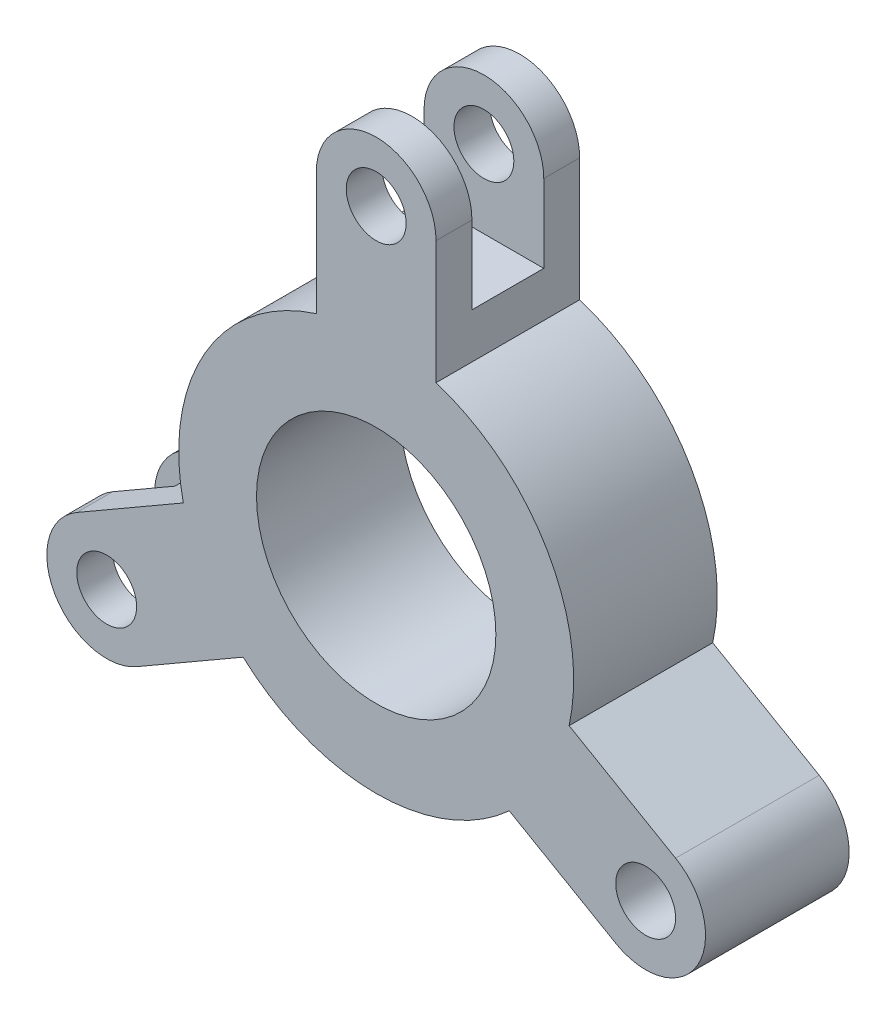
ISO-10303-21;
HEADER;
FILE_DESCRIPTION(('STEP AP214'),'2;1');
FILE_NAME('part.step','',(''),(''),'','','');
FILE_SCHEMA(('AUTOMOTIVE_DESIGN { 1 0 10303 214 1 1 1 1 }'));
ENDSEC;
DATA;
#1=APPLICATION_CONTEXT('core data for automotive mechanical design processes');
#2=APPLICATION_PROTOCOL_DEFINITION('international standard','automotive_design',2000,#1);
#3=PRODUCT_CONTEXT('',#1,'mechanical');
#4=PRODUCT('Part','Part','',(#3));
#5=PRODUCT_RELATED_PRODUCT_CATEGORY('part','',(#4));
#6=PRODUCT_DEFINITION_FORMATION('','',#4);
#7=PRODUCT_DEFINITION_CONTEXT('part definition',#1,'design');
#8=PRODUCT_DEFINITION('design','',#6,#7);
#9=PRODUCT_DEFINITION_SHAPE('','',#8);
#10=(LENGTH_UNIT() NAMED_UNIT(*) SI_UNIT(.MILLI.,.METRE.));
#11=(NAMED_UNIT(*) PLANE_ANGLE_UNIT() SI_UNIT($,.RADIAN.));
#12=(NAMED_UNIT(*) SI_UNIT($,.STERADIAN.) SOLID_ANGLE_UNIT());
#13=UNCERTAINTY_MEASURE_WITH_UNIT(LENGTH_MEASURE(1.E-05),#10,'distance_accuracy_value','');
#14=(GEOMETRIC_REPRESENTATION_CONTEXT(3) GLOBAL_UNCERTAINTY_ASSIGNED_CONTEXT((#13)) GLOBAL_UNIT_ASSIGNED_CONTEXT((#10,
#11,#12)) REPRESENTATION_CONTEXT('',''));
#15=CARTESIAN_POINT('',(0.,0.,0.));
#16=DIRECTION('',(0.,0.,1.));
#17=DIRECTION('',(1.,0.,0.));
#18=AXIS2_PLACEMENT_3D('',#15,#16,#17);
#19=CARTESIAN_POINT('',(-22.5166604983954,-13.,-6.));
#20=DIRECTION('',(0.,0.,1.));
#21=DIRECTION('',(1.,0.,0.));
#22=AXIS2_PLACEMENT_3D('',#19,#20,#21);
#23=CYLINDRICAL_SURFACE('',#22,5.);
#24=DIRECTION('',(0.,0.,1.));
#25=VECTOR('',#24,1.);
#26=CARTESIAN_POINT('',(-25.0166604983954,-8.6698729810778,-6.));
#27=LINE('',#26,#25);
#28=CARTESIAN_POINT('',(-25.0166604983954,-8.6698729810778,3.));
#29=VERTEX_POINT('',#28);
#30=CARTESIAN_POINT('',(-25.0166604983954,-8.6698729810778,6.));
#31=VERTEX_POINT('',#30);
#32=EDGE_CURVE('E365',#29,#31,#27,.T.);
#33=ORIENTED_EDGE('',*,*,#32,.F.);
#34=CARTESIAN_POINT('',(-22.5166604983954,-13.,3.));
#35=DIRECTION('',(0.,0.,-1.));
#36=DIRECTION('',(-1.,0.,0.));
#37=AXIS2_PLACEMENT_3D('',#34,#35,#36);
#38=CIRCLE('',#37,5.);
#39=CARTESIAN_POINT('',(-20.0166604983954,-17.3301270189222,3.));
#40=VERTEX_POINT('',#39);
#41=EDGE_CURVE('E64',#29,#40,#38,.F.);
#42=ORIENTED_EDGE('',*,*,#41,.T.);
#43=DIRECTION('',(0.,0.,1.));
#44=VECTOR('',#43,1.);
#45=CARTESIAN_POINT('',(-20.0166604983954,-17.3301270189222,-6.));
#46=LINE('',#45,#44);
#47=CARTESIAN_POINT('',(-20.0166604983954,-17.3301270189222,6.));
#48=VERTEX_POINT('',#47);
#49=EDGE_CURVE('E363',#40,#48,#46,.T.);
#50=ORIENTED_EDGE('',*,*,#49,.T.);
#51=CARTESIAN_POINT('',(-22.5166604983954,-13.,6.));
#52=DIRECTION('',(0.,0.,1.));
#53=DIRECTION('',(1.,0.,0.));
#54=AXIS2_PLACEMENT_3D('',#51,#52,#53);
#55=CIRCLE('',#54,5.);
#56=EDGE_CURVE('E251',#31,#48,#55,.T.);
#57=ORIENTED_EDGE('',*,*,#56,.F.);
#58=EDGE_LOOP('',(#33,#42,#50,#57));
#59=FACE_BOUND('',#58,.T.);
#60=ADVANCED_FACE('F49',(#59),#23,.T.);
#61=CARTESIAN_POINT('',(-22.5166604983954,-13.,-6.));
#62=DIRECTION('',(0.,0.,1.));
#63=DIRECTION('',(1.,0.,0.));
#64=AXIS2_PLACEMENT_3D('',#61,#62,#63);
#65=CYLINDRICAL_SURFACE('',#64,2.5);
#66=CARTESIAN_POINT('',(-22.5166604983954,-13.,6.));
#67=DIRECTION('',(0.,0.,1.));
#68=DIRECTION('',(1.,0.,0.));
#69=AXIS2_PLACEMENT_3D('',#66,#67,#68);
#70=CIRCLE('',#69,2.5);
#71=CARTESIAN_POINT('',(-20.0166604983954,-13.,6.));
#72=VERTEX_POINT('',#71);
#73=EDGE_CURVE('E290',#72,#72,#70,.T.);
#74=ORIENTED_EDGE('',*,*,#73,.T.);
#75=EDGE_LOOP('',(#74));
#76=FACE_BOUND('',#75,.T.);
#77=CARTESIAN_POINT('',(-22.5166604983954,-13.,3.));
#78=DIRECTION('',(0.,0.,-1.));
#79=DIRECTION('',(-1.,0.,0.));
#80=AXIS2_PLACEMENT_3D('',#77,#78,#79);
#81=CIRCLE('',#80,2.5);
#82=CARTESIAN_POINT('',(-25.0166604983954,-13.,3.));
#83=VERTEX_POINT('',#82);
#84=EDGE_CURVE('E191',#83,#83,#81,.F.);
#85=ORIENTED_EDGE('',*,*,#84,.F.);
#86=EDGE_LOOP('',(#85));
#87=FACE_BOUND('',#86,.T.);
#88=ADVANCED_FACE('F377',(#76,#87),#65,.F.);
#89=CARTESIAN_POINT('',(-5.,0.,-6.));
#90=DIRECTION('',(1.,0.,0.));
#91=DIRECTION('',(0.,0.,-1.));
#92=AXIS2_PLACEMENT_3D('',#89,#90,#91);
#93=PLANE('',#92);
#94=DIRECTION('',(0.,1.,0.));
#95=VECTOR('',#94,1.);
#96=CARTESIAN_POINT('',(-5.,0.,3.));
#97=LINE('',#96,#95);
#98=CARTESIAN_POINT('',(-5.,19.5,3.));
#99=VERTEX_POINT('',#98);
#100=CARTESIAN_POINT('',(-5.,26.,3.));
#101=VERTEX_POINT('',#100);
#102=EDGE_CURVE('E241',#99,#101,#97,.T.);
#103=ORIENTED_EDGE('',*,*,#102,.F.);
#104=DIRECTION('',(0.,0.,1.));
#105=VECTOR('',#104,1.);
#106=CARTESIAN_POINT('',(-5.,19.5,-6.));
#107=LINE('',#106,#105);
#108=CARTESIAN_POINT('',(-5.,19.5,-3.));
#109=VERTEX_POINT('',#108);
#110=EDGE_CURVE('E243',#109,#99,#107,.T.);
#111=ORIENTED_EDGE('',*,*,#110,.F.);
#112=DIRECTION('',(0.,1.,0.));
#113=VECTOR('',#112,1.);
#114=CARTESIAN_POINT('',(-5.,0.,-3.));
#115=LINE('',#114,#113);
#116=CARTESIAN_POINT('',(-5.,26.,-3.));
#117=VERTEX_POINT('',#116);
#118=EDGE_CURVE('E231',#109,#117,#115,.T.);
#119=ORIENTED_EDGE('',*,*,#118,.T.);
#120=DIRECTION('',(0.,0.,1.));
#121=VECTOR('',#120,1.);
#122=CARTESIAN_POINT('',(-5.,26.,-6.));
#123=LINE('',#122,#121);
#124=CARTESIAN_POINT('',(-5.,26.,-6.));
#125=VERTEX_POINT('',#124);
#126=EDGE_CURVE('E340',#125,#117,#123,.T.);
#127=ORIENTED_EDGE('',*,*,#126,.F.);
#128=DIRECTION('',(0.,1.,0.));
#129=VECTOR('',#128,1.);
#130=CARTESIAN_POINT('',(-5.,0.,-6.));
#131=LINE('',#130,#129);
#132=CARTESIAN_POINT('',(-5.,15.7241851935164,-6.));
#133=VERTEX_POINT('',#132);
#134=EDGE_CURVE('E323',#133,#125,#131,.T.);
#135=ORIENTED_EDGE('',*,*,#134,.F.);
#136=DIRECTION('',(0.,0.,1.));
#137=VECTOR('',#136,1.);
#138=CARTESIAN_POINT('',(-5.,15.7241851935164,-6.));
#139=LINE('',#138,#137);
#140=CARTESIAN_POINT('',(-5.,15.7241851935164,6.));
#141=VERTEX_POINT('',#140);
#142=EDGE_CURVE('E338',#133,#141,#139,.T.);
#143=ORIENTED_EDGE('',*,*,#142,.T.);
#144=DIRECTION('',(0.,1.,0.));
#145=VECTOR('',#144,1.);
#146=CARTESIAN_POINT('',(-5.,0.,6.));
#147=LINE('',#146,#145);
#148=CARTESIAN_POINT('',(-5.,26.,6.));
#149=VERTEX_POINT('',#148);
#150=EDGE_CURVE('E278',#141,#149,#147,.T.);
#151=ORIENTED_EDGE('',*,*,#150,.T.);
#152=EDGE_CURVE('E343',#101,#149,#123,.T.);
#153=ORIENTED_EDGE('',*,*,#152,.F.);
#154=EDGE_LOOP('',(#103,#111,#119,#127,#135,#143,#151,#153));
#155=FACE_BOUND('',#154,.T.);
#156=ADVANCED_FACE('F379',(#155),#93,.F.);
#157=CARTESIAN_POINT('',(0.,26.,-6.));
#158=DIRECTION('',(0.,0.,1.));
#159=DIRECTION('',(1.,0.,0.));
#160=AXIS2_PLACEMENT_3D('',#157,#158,#159);
#161=CYLINDRICAL_SURFACE('',#160,5.);
#162=DIRECTION('',(0.,0.,1.));
#163=VECTOR('',#162,1.);
#164=CARTESIAN_POINT('',(5.,26.,-6.));
#165=LINE('',#164,#163);
#166=CARTESIAN_POINT('',(5.,26.,3.));
#167=VERTEX_POINT('',#166);
#168=CARTESIAN_POINT('',(5.,26.,6.));
#169=VERTEX_POINT('',#168);
#170=EDGE_CURVE('E347',#167,#169,#165,.T.);
#171=ORIENTED_EDGE('',*,*,#170,.F.);
#172=CARTESIAN_POINT('',(0.,26.,3.));
#173=DIRECTION('',(0.,0.,-1.));
#174=DIRECTION('',(-1.,0.,0.));
#175=AXIS2_PLACEMENT_3D('',#172,#173,#174);
#176=CIRCLE('',#175,5.);
#177=EDGE_CURVE('E238',#167,#101,#176,.F.);
#178=ORIENTED_EDGE('',*,*,#177,.T.);
#179=ORIENTED_EDGE('',*,*,#152,.T.);
#180=CARTESIAN_POINT('',(0.,26.,6.));
#181=DIRECTION('',(0.,0.,1.));
#182=DIRECTION('',(1.,0.,0.));
#183=AXIS2_PLACEMENT_3D('',#180,#181,#182);
#184=CIRCLE('',#183,5.);
#185=EDGE_CURVE('E275',#169,#149,#184,.T.);
#186=ORIENTED_EDGE('',*,*,#185,.F.);
#187=EDGE_LOOP('',(#171,#178,#179,#186));
#188=FACE_BOUND('',#187,.T.);
#189=ADVANCED_FACE('F388',(#188),#161,.T.);
#190=CARTESIAN_POINT('',(5.,0.,-6.));
#191=DIRECTION('',(1.,0.,0.));
#192=DIRECTION('',(0.,0.,-1.));
#193=AXIS2_PLACEMENT_3D('',#190,#191,#192);
#194=PLANE('',#193);
#195=DIRECTION('',(0.,0.,1.));
#196=VECTOR('',#195,1.);
#197=CARTESIAN_POINT('',(5.,19.5,-6.));
#198=LINE('',#197,#196);
#199=CARTESIAN_POINT('',(5.,19.5,-3.));
#200=VERTEX_POINT('',#199);
#201=CARTESIAN_POINT('',(5.,19.5,3.));
#202=VERTEX_POINT('',#201);
#203=EDGE_CURVE('E57',#200,#202,#198,.T.);
#204=ORIENTED_EDGE('',*,*,#203,.T.);
#205=DIRECTION('',(0.,1.,0.));
#206=VECTOR('',#205,1.);
#207=CARTESIAN_POINT('',(5.,0.,3.));
#208=LINE('',#207,#206);
#209=EDGE_CURVE('E235',#202,#167,#208,.T.);
#210=ORIENTED_EDGE('',*,*,#209,.T.);
#211=ORIENTED_EDGE('',*,*,#170,.T.);
#212=DIRECTION('',(0.,1.,0.));
#213=VECTOR('',#212,1.);
#214=CARTESIAN_POINT('',(5.,0.,6.));
#215=LINE('',#214,#213);
#216=CARTESIAN_POINT('',(5.,15.7241851935164,6.));
#217=VERTEX_POINT('',#216);
#218=EDGE_CURVE('E272',#217,#169,#215,.T.);
#219=ORIENTED_EDGE('',*,*,#218,.F.);
#220=DIRECTION('',(0.,0.,1.));
#221=VECTOR('',#220,1.);
#222=CARTESIAN_POINT('',(5.,15.7241851935164,-6.));
#223=LINE('',#222,#221);
#224=CARTESIAN_POINT('',(5.,15.7241851935164,-6.));
#225=VERTEX_POINT('',#224);
#226=EDGE_CURVE('E348',#225,#217,#223,.T.);
#227=ORIENTED_EDGE('',*,*,#226,.F.);
#228=DIRECTION('',(0.,1.,0.));
#229=VECTOR('',#228,1.);
#230=CARTESIAN_POINT('',(5.,0.,-6.));
#231=LINE('',#230,#229);
#232=CARTESIAN_POINT('',(5.,26.,-6.));
#233=VERTEX_POINT('',#232);
#234=EDGE_CURVE('E317',#225,#233,#231,.T.);
#235=ORIENTED_EDGE('',*,*,#234,.T.);
#236=CARTESIAN_POINT('',(5.,26.,-3.));
#237=VERTEX_POINT('',#236);
#238=EDGE_CURVE('E344',#233,#237,#165,.T.);
#239=ORIENTED_EDGE('',*,*,#238,.T.);
#240=DIRECTION('',(0.,1.,0.));
#241=VECTOR('',#240,1.);
#242=CARTESIAN_POINT('',(5.,0.,-3.));
#243=LINE('',#242,#241);
#244=EDGE_CURVE('E227',#200,#237,#243,.T.);
#245=ORIENTED_EDGE('',*,*,#244,.F.);
#246=EDGE_LOOP('',(#204,#210,#211,#219,#227,#235,#239,#245));
#247=FACE_BOUND('',#246,.T.);
#248=ADVANCED_FACE('F439',(#247),#194,.T.);
#249=CARTESIAN_POINT('',(0.,26.,-6.));
#250=DIRECTION('',(0.,0.,1.));
#251=DIRECTION('',(1.,0.,0.));
#252=AXIS2_PLACEMENT_3D('',#249,#250,#251);
#253=CYLINDRICAL_SURFACE('',#252,2.5);
#254=CARTESIAN_POINT('',(0.,26.,6.));
#255=DIRECTION('',(0.,0.,1.));
#256=DIRECTION('',(1.,0.,0.));
#257=AXIS2_PLACEMENT_3D('',#254,#255,#256);
#258=CIRCLE('',#257,2.5);
#259=CARTESIAN_POINT('',(2.5,26.,6.));
#260=VERTEX_POINT('',#259);
#261=EDGE_CURVE('E284',#260,#260,#258,.T.);
#262=ORIENTED_EDGE('',*,*,#261,.T.);
#263=EDGE_LOOP('',(#262));
#264=FACE_BOUND('',#263,.T.);
#265=CARTESIAN_POINT('',(0.,26.,3.));
#266=DIRECTION('',(0.,0.,-1.));
#267=DIRECTION('',(-1.,0.,0.));
#268=AXIS2_PLACEMENT_3D('',#265,#266,#267);
#269=CIRCLE('',#268,2.5);
#270=CARTESIAN_POINT('',(-2.5,26.,3.));
#271=VERTEX_POINT('',#270);
#272=EDGE_CURVE('E234',#271,#271,#269,.F.);
#273=ORIENTED_EDGE('',*,*,#272,.F.);
#274=EDGE_LOOP('',(#273));
#275=FACE_BOUND('',#274,.T.);
#276=ADVANCED_FACE('F490',(#264,#275),#253,.F.);
#277=CARTESIAN_POINT('',(0.,0.,-6.));
#278=DIRECTION('',(0.,0.,1.));
#279=DIRECTION('',(1.,0.,0.));
#280=AXIS2_PLACEMENT_3D('',#277,#278,#279);
#281=CYLINDRICAL_SURFACE('',#280,16.5);
#282=DIRECTION('',(0.,0.,1.));
#283=VECTOR('',#282,1.);
#284=CARTESIAN_POINT('',(-16.1175438313963,-3.531965577836,-6.));
#285=LINE('',#284,#283);
#286=CARTESIAN_POINT('',(-16.1175438313963,-3.531965577836,-6.));
#287=VERTEX_POINT('',#286);
#288=CARTESIAN_POINT('',(-16.1175438313963,-3.531965577836,6.));
#289=VERTEX_POINT('',#288);
#290=EDGE_CURVE('E337',#287,#289,#285,.T.);
#291=ORIENTED_EDGE('',*,*,#290,.T.);
#292=CARTESIAN_POINT('',(0.,0.,6.));
#293=DIRECTION('',(0.,0.,1.));
#294=DIRECTION('',(1.,0.,0.));
#295=AXIS2_PLACEMENT_3D('',#292,#293,#294);
#296=CIRCLE('',#295,16.5);
#297=EDGE_CURVE('E245',#141,#289,#296,.T.);
#298=ORIENTED_EDGE('',*,*,#297,.F.);
#299=ORIENTED_EDGE('',*,*,#142,.F.);
#300=CARTESIAN_POINT('',(0.,0.,-6.));
#301=DIRECTION('',(0.,0.,1.));
#302=DIRECTION('',(1.,0.,0.));
#303=AXIS2_PLACEMENT_3D('',#300,#301,#302);
#304=CIRCLE('',#303,16.5);
#305=EDGE_CURVE('E293',#133,#287,#304,.T.);
#306=ORIENTED_EDGE('',*,*,#305,.T.);
#307=EDGE_LOOP('',(#291,#298,#299,#306));
#308=FACE_BOUND('',#307,.T.);
#309=ADVANCED_FACE('F51',(#308),#281,.T.);
#310=CARTESIAN_POINT('',(0.,26.,-3.));
#311=DIRECTION('',(0.,0.,-1.));
#312=DIRECTION('',(-1.,0.,0.));
#313=AXIS2_PLACEMENT_3D('',#310,#311,#312);
#314=CIRCLE('',#313,5.);
#315=EDGE_CURVE('E229',#237,#117,#314,.F.);
#316=ORIENTED_EDGE('',*,*,#315,.F.);
#317=ORIENTED_EDGE('',*,*,#238,.F.);
#318=CARTESIAN_POINT('',(0.,26.,-6.));
#319=DIRECTION('',(0.,0.,1.));
#320=DIRECTION('',(1.,0.,0.));
#321=AXIS2_PLACEMENT_3D('',#318,#319,#320);
#322=CIRCLE('',#321,5.);
#323=EDGE_CURVE('E320',#233,#125,#322,.T.);
#324=ORIENTED_EDGE('',*,*,#323,.T.);
#325=ORIENTED_EDGE('',*,*,#126,.T.);
#326=EDGE_LOOP('',(#316,#317,#324,#325));
#327=FACE_BOUND('',#326,.T.);
#328=ADVANCED_FACE('F497',(#327),#161,.T.);
#329=CARTESIAN_POINT('',(0.,0.,-6.));
#330=DIRECTION('',(0.,0.,1.));
#331=DIRECTION('',(1.,0.,0.));
#332=AXIS2_PLACEMENT_3D('',#329,#330,#331);
#333=CYLINDRICAL_SURFACE('',#332,16.5);
#334=ORIENTED_EDGE('',*,*,#226,.T.);
#335=CARTESIAN_POINT('',(0.,0.,6.));
#336=DIRECTION('',(0.,0.,1.));
#337=DIRECTION('',(1.,0.,0.));
#338=AXIS2_PLACEMENT_3D('',#335,#336,#337);
#339=CIRCLE('',#338,16.5);
#340=CARTESIAN_POINT('',(16.1175438313963,-3.53196557783599,6.));
#341=VERTEX_POINT('',#340);
#342=EDGE_CURVE('E269',#341,#217,#339,.T.);
#343=ORIENTED_EDGE('',*,*,#342,.F.);
#344=DIRECTION('',(0.,0.,1.));
#345=VECTOR('',#344,1.);
#346=CARTESIAN_POINT('',(16.1175438313963,-3.53196557783599,-6.));
#347=LINE('',#346,#345);
#348=CARTESIAN_POINT('',(16.1175438313963,-3.53196557783599,-6.));
#349=VERTEX_POINT('',#348);
#350=EDGE_CURVE('E350',#349,#341,#347,.T.);
#351=ORIENTED_EDGE('',*,*,#350,.F.);
#352=CARTESIAN_POINT('',(0.,0.,-6.));
#353=DIRECTION('',(0.,0.,1.));
#354=DIRECTION('',(1.,0.,0.));
#355=AXIS2_PLACEMENT_3D('',#352,#353,#354);
#356=CIRCLE('',#355,16.5);
#357=EDGE_CURVE('E314',#349,#225,#356,.T.);
#358=ORIENTED_EDGE('',*,*,#357,.T.);
#359=EDGE_LOOP('',(#334,#343,#351,#358));
#360=FACE_BOUND('',#359,.T.);
#361=ADVANCED_FACE('F444',(#360),#333,.T.);
#362=CARTESIAN_POINT('',(2.5,4.3301270189222,-6.));
#363=DIRECTION('',(-0.5,-0.866025403784439,0.));
#364=DIRECTION('',(0.866025403784439,-0.5,0.));
#365=AXIS2_PLACEMENT_3D('',#362,#363,#364);
#366=PLANE('',#365);
#367=ORIENTED_EDGE('',*,*,#350,.T.);
#368=DIRECTION('',(0.866025403784439,-0.5,0.));
#369=VECTOR('',#368,1.);
#370=CARTESIAN_POINT('',(2.5,4.3301270189222,6.));
#371=LINE('',#370,#369);
#372=CARTESIAN_POINT('',(25.0166604983954,-8.6698729810778,6.));
#373=VERTEX_POINT('',#372);
#374=EDGE_CURVE('E266',#341,#373,#371,.T.);
#375=ORIENTED_EDGE('',*,*,#374,.T.);
#376=DIRECTION('',(0.,0.,1.));
#377=VECTOR('',#376,1.);
#378=CARTESIAN_POINT('',(25.0166604983954,-8.6698729810778,-6.));
#379=LINE('',#378,#377);
#380=CARTESIAN_POINT('',(25.0166604983954,-8.6698729810778,-6.));
#381=VERTEX_POINT('',#380);
#382=EDGE_CURVE('E352',#381,#373,#379,.T.);
#383=ORIENTED_EDGE('',*,*,#382,.F.);
#384=DIRECTION('',(0.866025403784439,-0.5,0.));
#385=VECTOR('',#384,1.);
#386=CARTESIAN_POINT('',(2.5,4.3301270189222,-6.));
#387=LINE('',#386,#385);
#388=EDGE_CURVE('E312',#349,#381,#387,.T.);
#389=ORIENTED_EDGE('',*,*,#388,.F.);
#390=EDGE_LOOP('',(#367,#375,#383,#389));
#391=FACE_BOUND('',#390,.T.);
#392=ADVANCED_FACE('F450',(#391),#366,.F.);
#393=CARTESIAN_POINT('',(22.5166604983954,-13.,-6.));
#394=DIRECTION('',(0.,0.,1.));
#395=DIRECTION('',(1.,0.,0.));
#396=AXIS2_PLACEMENT_3D('',#393,#394,#395);
#397=CYLINDRICAL_SURFACE('',#396,5.);
#398=ORIENTED_EDGE('',*,*,#382,.T.);
#399=CARTESIAN_POINT('',(22.5166604983954,-13.,6.));
#400=DIRECTION('',(0.,0.,1.));
#401=DIRECTION('',(1.,0.,0.));
#402=AXIS2_PLACEMENT_3D('',#399,#400,#401);
#403=CIRCLE('',#402,5.);
#404=CARTESIAN_POINT('',(20.0166604983954,-17.3301270189222,6.));
#405=VERTEX_POINT('',#404);
#406=EDGE_CURVE('E263',#405,#373,#403,.T.);
#407=ORIENTED_EDGE('',*,*,#406,.F.);
#408=DIRECTION('',(0.,0.,1.));
#409=VECTOR('',#408,1.);
#410=CARTESIAN_POINT('',(20.0166604983954,-17.3301270189222,-6.));
#411=LINE('',#410,#409);
#412=CARTESIAN_POINT('',(20.0166604983954,-17.3301270189222,-6.));
#413=VERTEX_POINT('',#412);
#414=EDGE_CURVE('E354',#413,#405,#411,.T.);
#415=ORIENTED_EDGE('',*,*,#414,.F.);
#416=CARTESIAN_POINT('',(22.5166604983954,-13.,-6.));
#417=DIRECTION('',(0.,0.,1.));
#418=DIRECTION('',(1.,0.,0.));
#419=AXIS2_PLACEMENT_3D('',#416,#417,#418);
#420=CIRCLE('',#419,5.);
#421=EDGE_CURVE('E309',#413,#381,#420,.T.);
#422=ORIENTED_EDGE('',*,*,#421,.T.);
#423=EDGE_LOOP('',(#398,#407,#415,#422));
#424=FACE_BOUND('',#423,.T.);
#425=ADVANCED_FACE('F462',(#424),#397,.T.);
#426=CARTESIAN_POINT('',(-2.5,-4.33012701892219,-6.));
#427=DIRECTION('',(-0.5,-0.866025403784439,0.));
#428=DIRECTION('',(0.866025403784439,-0.5,0.));
#429=AXIS2_PLACEMENT_3D('',#426,#427,#428);
#430=PLANE('',#429);
#431=ORIENTED_EDGE('',*,*,#414,.T.);
#432=DIRECTION('',(0.866025403784439,-0.5,0.));
#433=VECTOR('',#432,1.);
#434=CARTESIAN_POINT('',(-2.5,-4.33012701892219,6.));
#435=LINE('',#434,#433);
#436=CARTESIAN_POINT('',(11.1175438313963,-12.1922196156804,6.));
#437=VERTEX_POINT('',#436);
#438=EDGE_CURVE('E260',#437,#405,#435,.T.);
#439=ORIENTED_EDGE('',*,*,#438,.F.);
#440=DIRECTION('',(0.,0.,1.));
#441=VECTOR('',#440,1.);
#442=CARTESIAN_POINT('',(11.1175438313963,-12.1922196156804,-6.));
#443=LINE('',#442,#441);
#444=CARTESIAN_POINT('',(11.1175438313963,-12.1922196156804,-6.));
#445=VERTEX_POINT('',#444);
#446=EDGE_CURVE('E356',#445,#437,#443,.T.);
#447=ORIENTED_EDGE('',*,*,#446,.F.);
#448=DIRECTION('',(0.866025403784439,-0.5,0.));
#449=VECTOR('',#448,1.);
#450=CARTESIAN_POINT('',(-2.5,-4.33012701892219,-6.));
#451=LINE('',#450,#449);
#452=EDGE_CURVE('E306',#445,#413,#451,.T.);
#453=ORIENTED_EDGE('',*,*,#452,.T.);
#454=EDGE_LOOP('',(#431,#439,#447,#453));
#455=FACE_BOUND('',#454,.T.);
#456=ADVANCED_FACE('F457',(#455),#430,.T.);
#457=CARTESIAN_POINT('',(0.,0.,-6.));
#458=DIRECTION('',(0.,0.,1.));
#459=DIRECTION('',(1.,0.,0.));
#460=AXIS2_PLACEMENT_3D('',#457,#458,#459);
#461=CYLINDRICAL_SURFACE('',#460,16.5);
#462=ORIENTED_EDGE('',*,*,#446,.T.);
#463=CARTESIAN_POINT('',(0.,0.,6.));
#464=DIRECTION('',(0.,0.,1.));
#465=DIRECTION('',(1.,0.,0.));
#466=AXIS2_PLACEMENT_3D('',#463,#464,#465);
#467=CIRCLE('',#466,16.5);
#468=CARTESIAN_POINT('',(-11.1175438313963,-12.1922196156804,6.));
#469=VERTEX_POINT('',#468);
#470=EDGE_CURVE('E257',#469,#437,#467,.T.);
#471=ORIENTED_EDGE('',*,*,#470,.F.);
#472=DIRECTION('',(0.,0.,1.));
#473=VECTOR('',#472,1.);
#474=CARTESIAN_POINT('',(-11.1175438313963,-12.1922196156804,-6.));
#475=LINE('',#474,#473);
#476=CARTESIAN_POINT('',(-11.1175438313963,-12.1922196156804,-6.));
#477=VERTEX_POINT('',#476);
#478=EDGE_CURVE('E358',#477,#469,#475,.T.);
#479=ORIENTED_EDGE('',*,*,#478,.F.);
#480=CARTESIAN_POINT('',(0.,0.,-6.));
#481=DIRECTION('',(0.,0.,1.));
#482=DIRECTION('',(1.,0.,0.));
#483=AXIS2_PLACEMENT_3D('',#480,#481,#482);
#484=CIRCLE('',#483,16.5);
#485=EDGE_CURVE('E303',#477,#445,#484,.T.);
#486=ORIENTED_EDGE('',*,*,#485,.T.);
#487=EDGE_LOOP('',(#462,#471,#479,#486));
#488=FACE_BOUND('',#487,.T.);
#489=ADVANCED_FACE('F461',(#488),#461,.T.);
#490=CARTESIAN_POINT('',(2.5,-4.3301270189222,-6.));
#491=DIRECTION('',(-0.5,0.866025403784439,0.));
#492=DIRECTION('',(-0.866025403784439,-0.5,0.));
#493=AXIS2_PLACEMENT_3D('',#490,#491,#492);
#494=PLANE('',#493);
#495=DIRECTION('',(0.,0.,1.));
#496=VECTOR('',#495,1.);
#497=CARTESIAN_POINT('',(-14.8205080756888,-14.3301270189222,-6.));
#498=LINE('',#497,#496);
#499=CARTESIAN_POINT('',(-14.8205080756888,-14.3301270189222,-3.));
#500=VERTEX_POINT('',#499);
#501=CARTESIAN_POINT('',(-14.8205080756888,-14.3301270189222,3.));
#502=VERTEX_POINT('',#501);
#503=EDGE_CURVE('E198',#500,#502,#498,.T.);
#504=ORIENTED_EDGE('',*,*,#503,.F.);
#505=DIRECTION('',(-0.866025403784439,-0.5,0.));
#506=VECTOR('',#505,1.);
#507=CARTESIAN_POINT('',(2.5,-4.3301270189222,-3.));
#508=LINE('',#507,#506);
#509=CARTESIAN_POINT('',(-20.0166604983954,-17.3301270189222,-3.));
#510=VERTEX_POINT('',#509);
#511=EDGE_CURVE('E212',#500,#510,#508,.T.);
#512=ORIENTED_EDGE('',*,*,#511,.T.);
#513=CARTESIAN_POINT('',(-20.0166604983954,-17.3301270189222,-6.));
#514=VERTEX_POINT('',#513);
#515=EDGE_CURVE('E360',#514,#510,#46,.T.);
#516=ORIENTED_EDGE('',*,*,#515,.F.);
#517=DIRECTION('',(-0.866025403784439,-0.5,0.));
#518=VECTOR('',#517,1.);
#519=CARTESIAN_POINT('',(2.5,-4.3301270189222,-6.));
#520=LINE('',#519,#518);
#521=EDGE_CURVE('E301',#477,#514,#520,.T.);
#522=ORIENTED_EDGE('',*,*,#521,.F.);
#523=ORIENTED_EDGE('',*,*,#478,.T.);
#524=DIRECTION('',(-0.866025403784439,-0.5,0.));
#525=VECTOR('',#524,1.);
#526=CARTESIAN_POINT('',(2.5,-4.3301270189222,6.));
#527=LINE('',#526,#525);
#528=EDGE_CURVE('E254',#469,#48,#527,.T.);
#529=ORIENTED_EDGE('',*,*,#528,.T.);
#530=ORIENTED_EDGE('',*,*,#49,.F.);
#531=DIRECTION('',(-0.866025403784439,-0.5,0.));
#532=VECTOR('',#531,1.);
#533=CARTESIAN_POINT('',(2.5,-4.3301270189222,3.));
#534=LINE('',#533,#532);
#535=EDGE_CURVE('E215',#502,#40,#534,.T.);
#536=ORIENTED_EDGE('',*,*,#535,.F.);
#537=EDGE_LOOP('',(#504,#512,#516,#522,#523,#529,#530,#536));
#538=FACE_BOUND('',#537,.T.);
#539=ADVANCED_FACE('F418',(#538),#494,.F.);
#540=CARTESIAN_POINT('',(-22.5166604983954,-13.,-3.));
#541=DIRECTION('',(0.,0.,-1.));
#542=DIRECTION('',(-1.,0.,0.));
#543=AXIS2_PLACEMENT_3D('',#540,#541,#542);
#544=CIRCLE('',#543,5.);
#545=CARTESIAN_POINT('',(-25.0166604983954,-8.6698729810778,-3.));
#546=VERTEX_POINT('',#545);
#547=EDGE_CURVE('E209',#546,#510,#544,.F.);
#548=ORIENTED_EDGE('',*,*,#547,.F.);
#549=CARTESIAN_POINT('',(-25.0166604983954,-8.6698729810778,-6.));
#550=VERTEX_POINT('',#549);
#551=EDGE_CURVE('E206',#550,#546,#27,.T.);
#552=ORIENTED_EDGE('',*,*,#551,.F.);
#553=CARTESIAN_POINT('',(-22.5166604983954,-13.,-6.));
#554=DIRECTION('',(0.,0.,1.));
#555=DIRECTION('',(1.,0.,0.));
#556=AXIS2_PLACEMENT_3D('',#553,#554,#555);
#557=CIRCLE('',#556,5.);
#558=EDGE_CURVE('E298',#550,#514,#557,.T.);
#559=ORIENTED_EDGE('',*,*,#558,.T.);
#560=ORIENTED_EDGE('',*,*,#515,.T.);
#561=EDGE_LOOP('',(#548,#552,#559,#560));
#562=FACE_BOUND('',#561,.T.);
#563=ADVANCED_FACE('F393',(#562),#23,.T.);
#564=CARTESIAN_POINT('',(22.5166604983954,-13.,-6.));
#565=DIRECTION('',(0.,0.,1.));
#566=DIRECTION('',(1.,0.,0.));
#567=AXIS2_PLACEMENT_3D('',#564,#565,#566);
#568=CYLINDRICAL_SURFACE('',#567,2.5);
#569=CARTESIAN_POINT('',(22.5166604983954,-13.,-6.));
#570=DIRECTION('',(0.,0.,1.));
#571=DIRECTION('',(1.,0.,0.));
#572=AXIS2_PLACEMENT_3D('',#569,#570,#571);
#573=CIRCLE('',#572,2.5);
#574=CARTESIAN_POINT('',(25.0166604983954,-13.,-6.));
#575=VERTEX_POINT('',#574);
#576=EDGE_CURVE('E331',#575,#575,#573,.T.);
#577=ORIENTED_EDGE('',*,*,#576,.F.);
#578=EDGE_LOOP('',(#577));
#579=FACE_BOUND('',#578,.T.);
#580=CARTESIAN_POINT('',(22.5166604983954,-13.,6.));
#581=DIRECTION('',(0.,0.,1.));
#582=DIRECTION('',(1.,0.,0.));
#583=AXIS2_PLACEMENT_3D('',#580,#581,#582);
#584=CIRCLE('',#583,2.5);
#585=CARTESIAN_POINT('',(25.0166604983954,-13.,6.));
#586=VERTEX_POINT('',#585);
#587=EDGE_CURVE('E287',#586,#586,#584,.T.);
#588=ORIENTED_EDGE('',*,*,#587,.T.);
#589=EDGE_LOOP('',(#588));
#590=FACE_BOUND('',#589,.T.);
#591=ADVANCED_FACE('F476',(#579,#590),#568,.F.);
#592=CARTESIAN_POINT('',(0.,26.,-3.));
#593=DIRECTION('',(0.,0.,-1.));
#594=DIRECTION('',(-1.,0.,0.));
#595=AXIS2_PLACEMENT_3D('',#592,#593,#594);
#596=CIRCLE('',#595,2.5);
#597=CARTESIAN_POINT('',(-2.5,26.,-3.));
#598=VERTEX_POINT('',#597);
#599=EDGE_CURVE('E226',#598,#598,#596,.F.);
#600=ORIENTED_EDGE('',*,*,#599,.T.);
#601=EDGE_LOOP('',(#600));
#602=FACE_BOUND('',#601,.T.);
#603=CARTESIAN_POINT('',(0.,26.,-6.));
#604=DIRECTION('',(0.,0.,1.));
#605=DIRECTION('',(1.,0.,0.));
#606=AXIS2_PLACEMENT_3D('',#603,#604,#605);
#607=CIRCLE('',#606,2.5);
#608=CARTESIAN_POINT('',(2.5,26.,-6.));
#609=VERTEX_POINT('',#608);
#610=EDGE_CURVE('E328',#609,#609,#607,.T.);
#611=ORIENTED_EDGE('',*,*,#610,.F.);
#612=EDGE_LOOP('',(#611));
#613=FACE_BOUND('',#612,.T.);
#614=ADVANCED_FACE('F481',(#602,#613),#253,.F.);
#615=CARTESIAN_POINT('',(0.,0.,-6.));
#616=DIRECTION('',(0.,0.,1.));
#617=DIRECTION('',(1.,0.,0.));
#618=AXIS2_PLACEMENT_3D('',#615,#616,#617);
#619=CYLINDRICAL_SURFACE('',#618,10.);
#620=CARTESIAN_POINT('',(0.,0.,-6.));
#621=DIRECTION('',(0.,0.,1.));
#622=DIRECTION('',(1.,0.,0.));
#623=AXIS2_PLACEMENT_3D('',#620,#621,#622);
#624=CIRCLE('',#623,10.);
#625=CARTESIAN_POINT('',(10.,0.,-6.));
#626=VERTEX_POINT('',#625);
#627=EDGE_CURVE('E325',#626,#626,#624,.T.);
#628=ORIENTED_EDGE('',*,*,#627,.F.);
#629=EDGE_LOOP('',(#628));
#630=FACE_BOUND('',#629,.T.);
#631=CARTESIAN_POINT('',(0.,0.,6.));
#632=DIRECTION('',(0.,0.,1.));
#633=DIRECTION('',(1.,0.,0.));
#634=AXIS2_PLACEMENT_3D('',#631,#632,#633);
#635=CIRCLE('',#634,10.);
#636=CARTESIAN_POINT('',(10.,0.,6.));
#637=VERTEX_POINT('',#636);
#638=EDGE_CURVE('E281',#637,#637,#635,.T.);
#639=ORIENTED_EDGE('',*,*,#638,.T.);
#640=EDGE_LOOP('',(#639));
#641=FACE_BOUND('',#640,.T.);
#642=ADVANCED_FACE('F406',(#630,#641),#619,.F.);
#643=CARTESIAN_POINT('',(-2.5,4.33012701892219,-6.));
#644=DIRECTION('',(-0.5,0.866025403784439,0.));
#645=DIRECTION('',(-0.866025403784439,-0.5,0.));
#646=AXIS2_PLACEMENT_3D('',#643,#644,#645);
#647=PLANE('',#646);
#648=DIRECTION('',(-0.866025403784439,-0.5,0.));
#649=VECTOR('',#648,1.);
#650=CARTESIAN_POINT('',(-2.5,4.33012701892219,-3.));
#651=LINE('',#650,#649);
#652=CARTESIAN_POINT('',(-19.8205080756888,-5.6698729810778,-3.));
#653=VERTEX_POINT('',#652);
#654=EDGE_CURVE('E204',#653,#546,#651,.T.);
#655=ORIENTED_EDGE('',*,*,#654,.F.);
#656=DIRECTION('',(0.,0.,1.));
#657=VECTOR('',#656,1.);
#658=CARTESIAN_POINT('',(-19.8205080756888,-5.6698729810778,-6.));
#659=LINE('',#658,#657);
#660=CARTESIAN_POINT('',(-19.8205080756888,-5.6698729810778,3.));
#661=VERTEX_POINT('',#660);
#662=EDGE_CURVE('E13',#653,#661,#659,.T.);
#663=ORIENTED_EDGE('',*,*,#662,.T.);
#664=DIRECTION('',(-0.866025403784439,-0.5,0.));
#665=VECTOR('',#664,1.);
#666=CARTESIAN_POINT('',(-2.5,4.33012701892219,3.));
#667=LINE('',#666,#665);
#668=EDGE_CURVE('E184',#661,#29,#667,.T.);
#669=ORIENTED_EDGE('',*,*,#668,.T.);
#670=ORIENTED_EDGE('',*,*,#32,.T.);
#671=DIRECTION('',(-0.866025403784439,-0.5,0.));
#672=VECTOR('',#671,1.);
#673=CARTESIAN_POINT('',(-2.5,4.33012701892219,6.));
#674=LINE('',#673,#672);
#675=EDGE_CURVE('E248',#289,#31,#674,.T.);
#676=ORIENTED_EDGE('',*,*,#675,.F.);
#677=ORIENTED_EDGE('',*,*,#290,.F.);
#678=DIRECTION('',(-0.866025403784439,-0.5,0.));
#679=VECTOR('',#678,1.);
#680=CARTESIAN_POINT('',(-2.5,4.33012701892219,-6.));
#681=LINE('',#680,#679);
#682=EDGE_CURVE('E296',#287,#550,#681,.T.);
#683=ORIENTED_EDGE('',*,*,#682,.T.);
#684=ORIENTED_EDGE('',*,*,#551,.T.);
#685=EDGE_LOOP('',(#655,#663,#669,#670,#676,#677,#683,#684));
#686=FACE_BOUND('',#685,.T.);
#687=ADVANCED_FACE('F202',(#686),#647,.T.);
#688=CARTESIAN_POINT('',(-22.5166604983954,-13.,-3.));
#689=DIRECTION('',(0.,0.,-1.));
#690=DIRECTION('',(-1.,0.,0.));
#691=AXIS2_PLACEMENT_3D('',#688,#689,#690);
#692=CIRCLE('',#691,2.5);
#693=CARTESIAN_POINT('',(-25.0166604983954,-13.,-3.));
#694=VERTEX_POINT('',#693);
#695=EDGE_CURVE('E210',#694,#694,#692,.F.);
#696=ORIENTED_EDGE('',*,*,#695,.T.);
#697=EDGE_LOOP('',(#696));
#698=FACE_BOUND('',#697,.T.);
#699=CARTESIAN_POINT('',(-22.5166604983954,-13.,-6.));
#700=DIRECTION('',(0.,0.,1.));
#701=DIRECTION('',(1.,0.,0.));
#702=AXIS2_PLACEMENT_3D('',#699,#700,#701);
#703=CIRCLE('',#702,2.5);
#704=CARTESIAN_POINT('',(-20.0166604983954,-13.,-6.));
#705=VERTEX_POINT('',#704);
#706=EDGE_CURVE('E334',#705,#705,#703,.T.);
#707=ORIENTED_EDGE('',*,*,#706,.F.);
#708=EDGE_LOOP('',(#707));
#709=FACE_BOUND('',#708,.T.);
#710=ADVANCED_FACE('F382',(#698,#709),#65,.F.);
#711=CARTESIAN_POINT('',(0.,0.,-6.));
#712=DIRECTION('',(0.,0.,1.));
#713=DIRECTION('',(1.,0.,0.));
#714=AXIS2_PLACEMENT_3D('',#711,#712,#713);
#715=PLANE('',#714);
#716=ORIENTED_EDGE('',*,*,#305,.F.);
#717=ORIENTED_EDGE('',*,*,#134,.T.);
#718=ORIENTED_EDGE('',*,*,#323,.F.);
#719=ORIENTED_EDGE('',*,*,#234,.F.);
#720=ORIENTED_EDGE('',*,*,#357,.F.);
#721=ORIENTED_EDGE('',*,*,#388,.T.);
#722=ORIENTED_EDGE('',*,*,#421,.F.);
#723=ORIENTED_EDGE('',*,*,#452,.F.);
#724=ORIENTED_EDGE('',*,*,#485,.F.);
#725=ORIENTED_EDGE('',*,*,#521,.T.);
#726=ORIENTED_EDGE('',*,*,#558,.F.);
#727=ORIENTED_EDGE('',*,*,#682,.F.);
#728=EDGE_LOOP('',(#716,#717,#718,#719,#720,#721,#722,#723,#724,#725,#726,#727));
#729=FACE_BOUND('',#728,.T.);
#730=ORIENTED_EDGE('',*,*,#627,.T.);
#731=EDGE_LOOP('',(#730));
#732=FACE_BOUND('',#731,.T.);
#733=ORIENTED_EDGE('',*,*,#610,.T.);
#734=EDGE_LOOP('',(#733));
#735=FACE_BOUND('',#734,.T.);
#736=ORIENTED_EDGE('',*,*,#576,.T.);
#737=EDGE_LOOP('',(#736));
#738=FACE_BOUND('',#737,.T.);
#739=ORIENTED_EDGE('',*,*,#706,.T.);
#740=EDGE_LOOP('',(#739));
#741=FACE_BOUND('',#740,.T.);
#742=ADVANCED_FACE('F397',(#729,#732,#735,#738,#741),#715,.F.);
#743=CARTESIAN_POINT('',(0.,0.,6.));
#744=DIRECTION('',(0.,0.,1.));
#745=DIRECTION('',(1.,0.,0.));
#746=AXIS2_PLACEMENT_3D('',#743,#744,#745);
#747=PLANE('',#746);
#748=ORIENTED_EDGE('',*,*,#297,.T.);
#749=ORIENTED_EDGE('',*,*,#675,.T.);
#750=ORIENTED_EDGE('',*,*,#56,.T.);
#751=ORIENTED_EDGE('',*,*,#528,.F.);
#752=ORIENTED_EDGE('',*,*,#470,.T.);
#753=ORIENTED_EDGE('',*,*,#438,.T.);
#754=ORIENTED_EDGE('',*,*,#406,.T.);
#755=ORIENTED_EDGE('',*,*,#374,.F.);
#756=ORIENTED_EDGE('',*,*,#342,.T.);
#757=ORIENTED_EDGE('',*,*,#218,.T.);
#758=ORIENTED_EDGE('',*,*,#185,.T.);
#759=ORIENTED_EDGE('',*,*,#150,.F.);
#760=EDGE_LOOP('',(#748,#749,#750,#751,#752,#753,#754,#755,#756,#757,#758,#759));
#761=FACE_BOUND('',#760,.T.);
#762=ORIENTED_EDGE('',*,*,#638,.F.);
#763=EDGE_LOOP('',(#762));
#764=FACE_BOUND('',#763,.T.);
#765=ORIENTED_EDGE('',*,*,#261,.F.);
#766=EDGE_LOOP('',(#765));
#767=FACE_BOUND('',#766,.T.);
#768=ORIENTED_EDGE('',*,*,#587,.F.);
#769=EDGE_LOOP('',(#768));
#770=FACE_BOUND('',#769,.T.);
#771=ORIENTED_EDGE('',*,*,#73,.F.);
#772=EDGE_LOOP('',(#771));
#773=FACE_BOUND('',#772,.T.);
#774=ADVANCED_FACE('F404',(#761,#764,#767,#770,#773),#747,.T.);
#775=CARTESIAN_POINT('',(-7.5,19.5,3.));
#776=DIRECTION('',(0.,1.,0.));
#777=DIRECTION('',(0.,0.,1.));
#778=AXIS2_PLACEMENT_3D('',#775,#776,#777);
#779=PLANE('',#778);
#780=ORIENTED_EDGE('',*,*,#110,.T.);
#781=DIRECTION('',(1.,0.,0.));
#782=VECTOR('',#781,1.);
#783=CARTESIAN_POINT('',(-7.5,19.5,3.));
#784=LINE('',#783,#782);
#785=EDGE_CURVE('E223',#99,#202,#784,.T.);
#786=ORIENTED_EDGE('',*,*,#785,.T.);
#787=ORIENTED_EDGE('',*,*,#203,.F.);
#788=DIRECTION('',(1.,0.,0.));
#789=VECTOR('',#788,1.);
#790=CARTESIAN_POINT('',(-7.5,19.5,-3.));
#791=LINE('',#790,#789);
#792=EDGE_CURVE('E72',#109,#200,#791,.T.);
#793=ORIENTED_EDGE('',*,*,#792,.F.);
#794=EDGE_LOOP('',(#780,#786,#787,#793));
#795=FACE_BOUND('',#794,.T.);
#796=ADVANCED_FACE('F561',(#795),#779,.T.);
#797=CARTESIAN_POINT('',(0.,0.,3.));
#798=DIRECTION('',(0.,0.,-1.));
#799=DIRECTION('',(-1.,0.,0.));
#800=AXIS2_PLACEMENT_3D('',#797,#798,#799);
#801=PLANE('',#800);
#802=ORIENTED_EDGE('',*,*,#272,.T.);
#803=EDGE_LOOP('',(#802));
#804=FACE_BOUND('',#803,.T.);
#805=ORIENTED_EDGE('',*,*,#102,.T.);
#806=ORIENTED_EDGE('',*,*,#177,.F.);
#807=ORIENTED_EDGE('',*,*,#209,.F.);
#808=ORIENTED_EDGE('',*,*,#785,.F.);
#809=EDGE_LOOP('',(#805,#806,#807,#808));
#810=FACE_BOUND('',#809,.T.);
#811=ADVANCED_FACE('F609',(#804,#810),#801,.T.);
#812=CARTESIAN_POINT('',(0.,0.,-3.));
#813=DIRECTION('',(0.,0.,-1.));
#814=DIRECTION('',(-1.,0.,0.));
#815=AXIS2_PLACEMENT_3D('',#812,#813,#814);
#816=PLANE('',#815);
#817=ORIENTED_EDGE('',*,*,#599,.F.);
#818=EDGE_LOOP('',(#817));
#819=FACE_BOUND('',#818,.T.);
#820=ORIENTED_EDGE('',*,*,#792,.T.);
#821=ORIENTED_EDGE('',*,*,#244,.T.);
#822=ORIENTED_EDGE('',*,*,#315,.T.);
#823=ORIENTED_EDGE('',*,*,#118,.F.);
#824=EDGE_LOOP('',(#820,#821,#822,#823));
#825=FACE_BOUND('',#824,.T.);
#826=ADVANCED_FACE('F619',(#819,#825),#816,.F.);
#827=CARTESIAN_POINT('',(-11.8205080756888,-19.5262794416288,35.9433060453589));
#828=DIRECTION('',(-0.866025403784438,-0.5,0.));
#829=DIRECTION('',(0.5,-0.866025403784439,0.));
#830=AXIS2_PLACEMENT_3D('',#827,#828,#829);
#831=PLANE('',#830);
#832=ORIENTED_EDGE('',*,*,#503,.T.);
#833=DIRECTION('',(0.5,-0.866025403784439,0.));
#834=VECTOR('',#833,1.);
#835=CARTESIAN_POINT('',(-11.8205080756888,-19.5262794416288,3.));
#836=LINE('',#835,#834);
#837=EDGE_CURVE('E187',#661,#502,#836,.T.);
#838=ORIENTED_EDGE('',*,*,#837,.F.);
#839=ORIENTED_EDGE('',*,*,#662,.F.);
#840=DIRECTION('',(-0.5,0.866025403784438,0.));
#841=VECTOR('',#840,1.);
#842=CARTESIAN_POINT('',(-11.8205080756888,-19.5262794416288,-3.));
#843=LINE('',#842,#841);
#844=EDGE_CURVE('E199',#500,#653,#843,.T.);
#845=ORIENTED_EDGE('',*,*,#844,.F.);
#846=EDGE_LOOP('',(#832,#838,#839,#845));
#847=FACE_BOUND('',#846,.T.);
#848=ADVANCED_FACE('F194',(#847),#831,.T.);
#849=CARTESIAN_POINT('',(0.,0.,-3.));
#850=DIRECTION('',(0.,0.,-1.));
#851=DIRECTION('',(-1.,0.,0.));
#852=AXIS2_PLACEMENT_3D('',#849,#850,#851);
#853=PLANE('',#852);
#854=ORIENTED_EDGE('',*,*,#695,.F.);
#855=EDGE_LOOP('',(#854));
#856=FACE_BOUND('',#855,.T.);
#857=ORIENTED_EDGE('',*,*,#844,.T.);
#858=ORIENTED_EDGE('',*,*,#654,.T.);
#859=ORIENTED_EDGE('',*,*,#547,.T.);
#860=ORIENTED_EDGE('',*,*,#511,.F.);
#861=EDGE_LOOP('',(#857,#858,#859,#860));
#862=FACE_BOUND('',#861,.T.);
#863=ADVANCED_FACE('F412',(#856,#862),#853,.F.);
#864=CARTESIAN_POINT('',(0.,0.,3.));
#865=DIRECTION('',(0.,0.,-1.));
#866=DIRECTION('',(-1.,0.,0.));
#867=AXIS2_PLACEMENT_3D('',#864,#865,#866);
#868=PLANE('',#867);
#869=ORIENTED_EDGE('',*,*,#84,.T.);
#870=EDGE_LOOP('',(#869));
#871=FACE_BOUND('',#870,.T.);
#872=ORIENTED_EDGE('',*,*,#535,.T.);
#873=ORIENTED_EDGE('',*,*,#41,.F.);
#874=ORIENTED_EDGE('',*,*,#668,.F.);
#875=ORIENTED_EDGE('',*,*,#837,.T.);
#876=EDGE_LOOP('',(#872,#873,#874,#875));
#877=FACE_BOUND('',#876,.T.);
#878=ADVANCED_FACE('F186',(#871,#877),#868,.T.);
#879=CLOSED_SHELL('',(#60,#88,#156,#189,#248,#276,#309,#328,#361,#392,#425,#456,#489,#539,#563,
#591,#614,#642,#687,#710,#742,#774,#796,#811,#826,#848,#863,#878));
#880=MANIFOLD_SOLID_BREP('B2',#879);
#881=ADVANCED_BREP_SHAPE_REPRESENTATION('',(#18,#880),#14);
#882=SHAPE_DEFINITION_REPRESENTATION(#9,#881);
ENDSEC;
END-ISO-10303-21;
